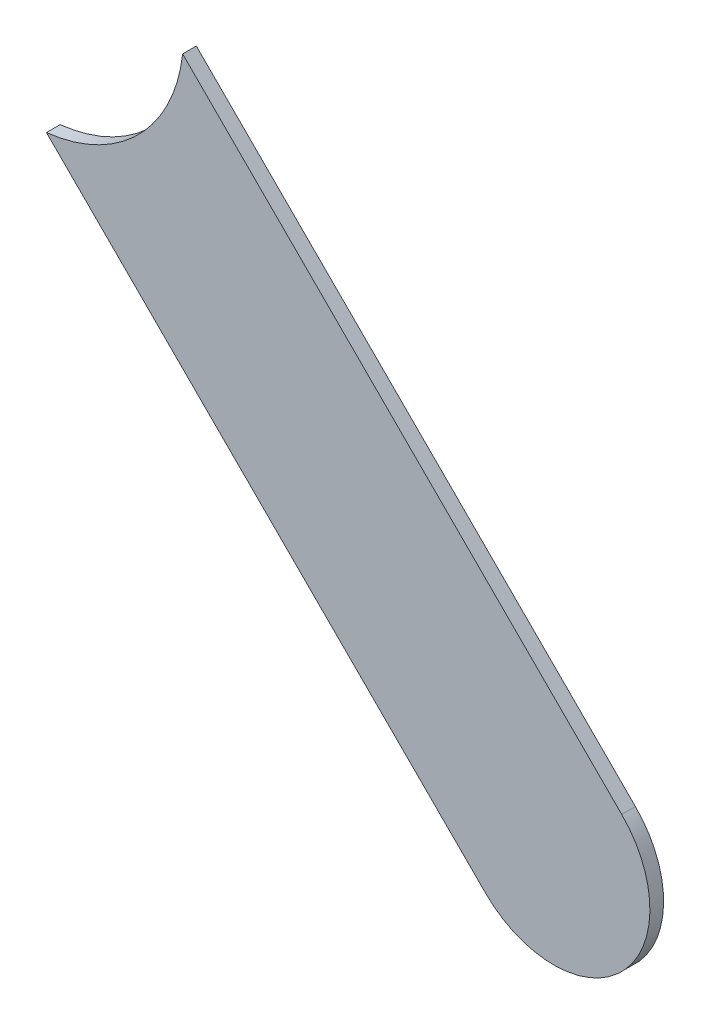
ISO-10303-21;
HEADER;
FILE_DESCRIPTION(('STEP AP214'),'2;1');
FILE_NAME('part.step','',(''),(''),'','','');
FILE_SCHEMA(('AUTOMOTIVE_DESIGN { 1 0 10303 214 1 1 1 1 }'));
ENDSEC;
DATA;
#1=APPLICATION_CONTEXT('core data for automotive mechanical design processes');
#2=APPLICATION_PROTOCOL_DEFINITION('international standard','automotive_design',2000,#1);
#3=PRODUCT_CONTEXT('',#1,'mechanical');
#4=PRODUCT('Part','Part','',(#3));
#5=PRODUCT_RELATED_PRODUCT_CATEGORY('part','',(#4));
#6=PRODUCT_DEFINITION_FORMATION('','',#4);
#7=PRODUCT_DEFINITION_CONTEXT('part definition',#1,'design');
#8=PRODUCT_DEFINITION('design','',#6,#7);
#9=PRODUCT_DEFINITION_SHAPE('','',#8);
#10=(LENGTH_UNIT() NAMED_UNIT(*) SI_UNIT(.MILLI.,.METRE.));
#11=(NAMED_UNIT(*) PLANE_ANGLE_UNIT() SI_UNIT($,.RADIAN.));
#12=(NAMED_UNIT(*) SI_UNIT($,.STERADIAN.) SOLID_ANGLE_UNIT());
#13=UNCERTAINTY_MEASURE_WITH_UNIT(LENGTH_MEASURE(1.E-05),#10,'distance_accuracy_value','');
#14=(GEOMETRIC_REPRESENTATION_CONTEXT(3) GLOBAL_UNCERTAINTY_ASSIGNED_CONTEXT((#13)) GLOBAL_UNIT_ASSIGNED_CONTEXT((#10,
#11,#12)) REPRESENTATION_CONTEXT('',''));
#15=CARTESIAN_POINT('',(0.,0.,0.));
#16=DIRECTION('',(0.,0.,1.));
#17=DIRECTION('',(1.,0.,0.));
#18=AXIS2_PLACEMENT_3D('',#15,#16,#17);
#19=CARTESIAN_POINT('',(62.5440191694402,74.9024572705598,0.));
#20=DIRECTION('',(0.707106781186548,0.707106781186548,0.));
#21=DIRECTION('',(0.707106781186548,-0.707106781186548,0.));
#22=AXIS2_PLACEMENT_3D('',#19,#20,#21);
#23=PLANE('',#22);
#24=DIRECTION('',(0.707106781186548,-0.707106781186548,0.));
#25=VECTOR('',#24,1.);
#26=CARTESIAN_POINT('',(62.32322562,75.12325082,0.03556));
#27=LINE('',#26,#25);
#28=CARTESIAN_POINT('',(62.5440191694402,74.9024572705598,0.03556));
#29=VERTEX_POINT('',#28);
#30=CARTESIAN_POINT('',(63.68385282,73.76262362,0.03556));
#31=VERTEX_POINT('',#30);
#32=EDGE_CURVE('E11',#29,#31,#27,.T.);
#33=ORIENTED_EDGE('',*,*,#32,.F.);
#34=DIRECTION('',(0.,0.,1.));
#35=VECTOR('',#34,1.);
#36=CARTESIAN_POINT('',(62.5440191694402,74.9024572705598,0.));
#37=LINE('',#36,#35);
#38=CARTESIAN_POINT('',(62.5440191694402,74.9024572705598,0.));
#39=VERTEX_POINT('',#38);
#40=EDGE_CURVE('E24',#39,#29,#37,.T.);
#41=ORIENTED_EDGE('',*,*,#40,.F.);
#42=DIRECTION('',(0.707106781186548,-0.707106781186548,0.));
#43=VECTOR('',#42,1.);
#44=CARTESIAN_POINT('',(62.32322562,75.12325082,0.));
#45=LINE('',#44,#43);
#46=CARTESIAN_POINT('',(63.68385282,73.76262362,0.));
#47=VERTEX_POINT('',#46);
#48=EDGE_CURVE('E75',#39,#47,#45,.T.);
#49=ORIENTED_EDGE('',*,*,#48,.T.);
#50=DIRECTION('',(0.,0.,1.));
#51=VECTOR('',#50,1.);
#52=CARTESIAN_POINT('',(63.68385282,73.76262362,0.));
#53=LINE('',#52,#51);
#54=EDGE_CURVE('E37',#47,#31,#53,.T.);
#55=ORIENTED_EDGE('',*,*,#54,.T.);
#56=EDGE_LOOP('',(#33,#41,#49,#55));
#57=FACE_BOUND('',#56,.T.);
#58=ADVANCED_FACE('F17',(#57),#23,.F.);
#59=CARTESIAN_POINT('',(63.8606292,73.9394,0.));
#60=DIRECTION('',(0.,0.,-1.));
#61=DIRECTION('',(-0.707106781186533,-0.707106781186562,0.));
#62=AXIS2_PLACEMENT_3D('',#59,#60,#61);
#63=CYLINDRICAL_SURFACE('',#62,0.249999554103225);
#64=CARTESIAN_POINT('',(63.8606292,73.9394,0.03556));
#65=DIRECTION('',(0.,0.,1.));
#66=DIRECTION('',(-0.707106781186533,-0.707106781186562,0.));
#67=AXIS2_PLACEMENT_3D('',#64,#65,#66);
#68=CIRCLE('',#67,0.249999554103225);
#69=CARTESIAN_POINT('',(64.03740558,74.11617638,0.03556));
#70=VERTEX_POINT('',#69);
#71=EDGE_CURVE('E83',#31,#70,#68,.T.);
#72=ORIENTED_EDGE('',*,*,#71,.F.);
#73=ORIENTED_EDGE('',*,*,#54,.F.);
#74=CARTESIAN_POINT('',(63.8606292,73.9394,0.));
#75=DIRECTION('',(0.,0.,1.));
#76=DIRECTION('',(-0.707106781186533,-0.707106781186562,0.));
#77=AXIS2_PLACEMENT_3D('',#74,#75,#76);
#78=CIRCLE('',#77,0.249999554103225);
#79=CARTESIAN_POINT('',(64.03740558,74.11617638,0.));
#80=VERTEX_POINT('',#79);
#81=EDGE_CURVE('E81',#47,#80,#78,.T.);
#82=ORIENTED_EDGE('',*,*,#81,.T.);
#83=DIRECTION('',(0.,0.,1.));
#84=VECTOR('',#83,1.);
#85=CARTESIAN_POINT('',(64.03740558,74.11617638,0.));
#86=LINE('',#85,#84);
#87=EDGE_CURVE('E67',#80,#70,#86,.T.);
#88=ORIENTED_EDGE('',*,*,#87,.T.);
#89=EDGE_LOOP('',(#72,#73,#82,#88));
#90=FACE_BOUND('',#89,.T.);
#91=ADVANCED_FACE('F89',(#90),#63,.T.);
#92=CARTESIAN_POINT('',(64.03740558,74.11617638,0.));
#93=DIRECTION('',(-0.707106781186546,-0.707106781186549,0.));
#94=DIRECTION('',(-0.707106781186549,0.707106781186546,0.));
#95=AXIS2_PLACEMENT_3D('',#92,#93,#94);
#96=PLANE('',#95);
#97=DIRECTION('',(-0.707106781186549,0.707106781186546,0.));
#98=VECTOR('',#97,1.);
#99=CARTESIAN_POINT('',(64.03740558,74.11617638,0.03556));
#100=LINE('',#99,#98);
#101=CARTESIAN_POINT('',(62.8975719294402,75.2560100305598,0.03556));
#102=VERTEX_POINT('',#101);
#103=EDGE_CURVE('E71',#70,#102,#100,.T.);
#104=ORIENTED_EDGE('',*,*,#103,.F.);
#105=ORIENTED_EDGE('',*,*,#87,.F.);
#106=DIRECTION('',(-0.707106781186549,0.707106781186546,0.));
#107=VECTOR('',#106,1.);
#108=CARTESIAN_POINT('',(64.03740558,74.11617638,0.));
#109=LINE('',#108,#107);
#110=CARTESIAN_POINT('',(62.8975719294402,75.2560100305598,0.));
#111=VERTEX_POINT('',#110);
#112=EDGE_CURVE('E63',#80,#111,#109,.T.);
#113=ORIENTED_EDGE('',*,*,#112,.T.);
#114=DIRECTION('',(0.,0.,1.));
#115=VECTOR('',#114,1.);
#116=CARTESIAN_POINT('',(62.8975719294402,75.2560100305598,0.));
#117=LINE('',#116,#115);
#118=EDGE_CURVE('E53',#111,#102,#117,.T.);
#119=ORIENTED_EDGE('',*,*,#118,.T.);
#120=EDGE_LOOP('',(#104,#105,#113,#119));
#121=FACE_BOUND('',#120,.T.);
#122=ADVANCED_FACE('F66',(#121),#96,.F.);
#123=CARTESIAN_POINT('',(62.500002,75.3000272,0.));
#124=DIRECTION('',(0.,0.,-1.));
#125=DIRECTION('',(1.,0.,0.));
#126=AXIS2_PLACEMENT_3D('',#123,#124,#125);
#127=CYLINDRICAL_SURFACE('',#126,0.3999992);
#128=ORIENTED_EDGE('',*,*,#40,.T.);
#129=CARTESIAN_POINT('',(62.500002,75.3000272,0.03556));
#130=DIRECTION('',(0.,0.,1.));
#131=DIRECTION('',(1.,0.,0.));
#132=AXIS2_PLACEMENT_3D('',#129,#130,#131);
#133=CIRCLE('',#132,0.3999992);
#134=EDGE_CURVE('E59',#29,#102,#133,.T.);
#135=ORIENTED_EDGE('',*,*,#134,.T.);
#136=ORIENTED_EDGE('',*,*,#118,.F.);
#137=CARTESIAN_POINT('',(62.500002,75.3000272,0.));
#138=DIRECTION('',(0.,0.,1.));
#139=DIRECTION('',(1.,0.,0.));
#140=AXIS2_PLACEMENT_3D('',#137,#138,#139);
#141=CIRCLE('',#140,0.3999992);
#142=EDGE_CURVE('E57',#39,#111,#141,.T.);
#143=ORIENTED_EDGE('',*,*,#142,.F.);
#144=EDGE_LOOP('',(#128,#135,#136,#143));
#145=FACE_BOUND('',#144,.T.);
#146=ADVANCED_FACE('F55',(#145),#127,.F.);
#147=CARTESIAN_POINT('',(62.32322562,75.12325082,0.));
#148=DIRECTION('',(0.,0.,-1.));
#149=DIRECTION('',(-1.,0.,0.));
#150=AXIS2_PLACEMENT_3D('',#147,#148,#149);
#151=PLANE('',#150);
#152=ORIENTED_EDGE('',*,*,#48,.F.);
#153=ORIENTED_EDGE('',*,*,#142,.T.);
#154=ORIENTED_EDGE('',*,*,#112,.F.);
#155=ORIENTED_EDGE('',*,*,#81,.F.);
#156=EDGE_LOOP('',(#152,#153,#154,#155));
#157=FACE_BOUND('',#156,.T.);
#158=ADVANCED_FACE('F74',(#157),#151,.T.);
#159=CARTESIAN_POINT('',(62.32322562,75.12325082,0.03556));
#160=DIRECTION('',(0.,0.,-1.));
#161=DIRECTION('',(-1.,0.,0.));
#162=AXIS2_PLACEMENT_3D('',#159,#160,#161);
#163=PLANE('',#162);
#164=ORIENTED_EDGE('',*,*,#134,.F.);
#165=ORIENTED_EDGE('',*,*,#32,.T.);
#166=ORIENTED_EDGE('',*,*,#71,.T.);
#167=ORIENTED_EDGE('',*,*,#103,.T.);
#168=EDGE_LOOP('',(#164,#165,#166,#167));
#169=FACE_BOUND('',#168,.T.);
#170=ADVANCED_FACE('F91',(#169),#163,.F.);
#171=CLOSED_SHELL('',(#58,#91,#122,#146,#158,#170));
#172=MANIFOLD_SOLID_BREP('B1',#171);
#173=ADVANCED_BREP_SHAPE_REPRESENTATION('',(#18,#172),#14);
#174=SHAPE_DEFINITION_REPRESENTATION(#9,#173);
ENDSEC;
END-ISO-10303-21;
